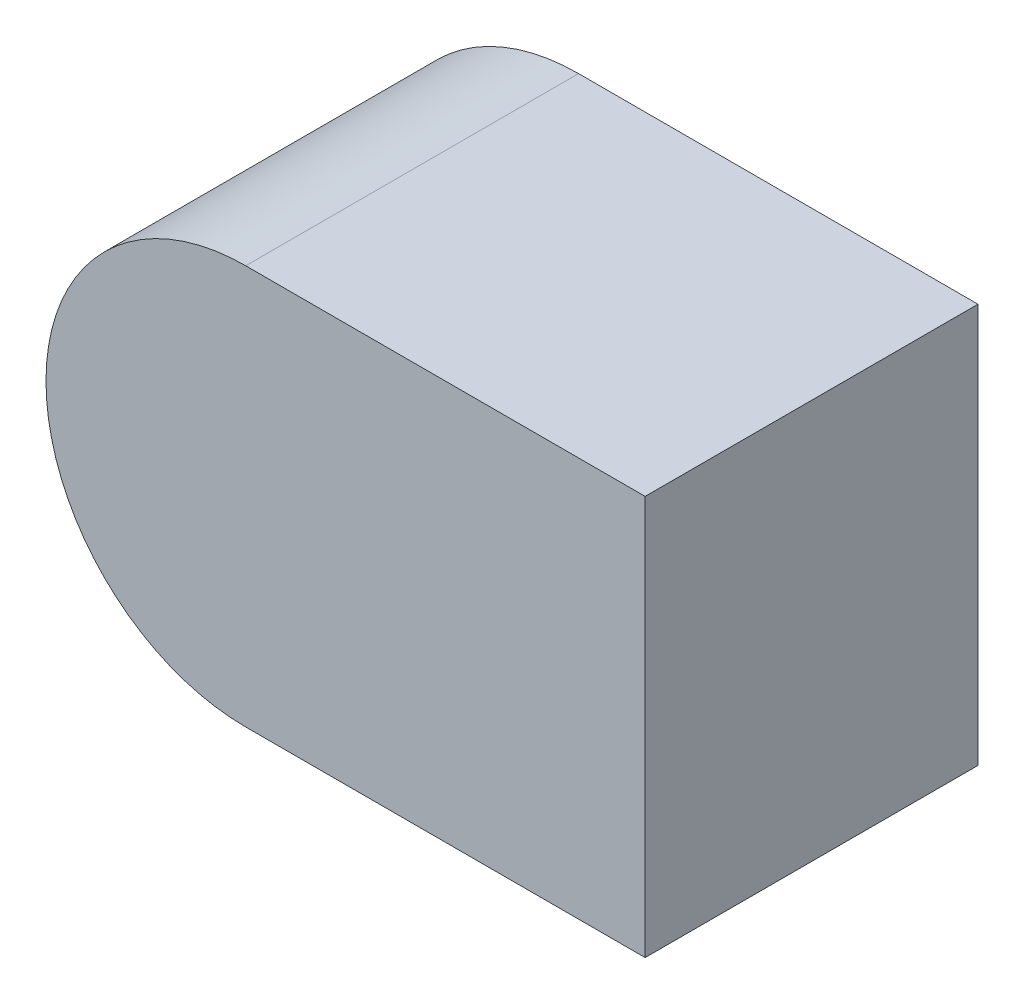
ISO-10303-21;
HEADER;
FILE_DESCRIPTION(('STEP AP214'),'2;1');
FILE_NAME('part.step','',(''),(''),'','','');
FILE_SCHEMA(('AUTOMOTIVE_DESIGN { 1 0 10303 214 1 1 1 1 }'));
ENDSEC;
DATA;
#1=APPLICATION_CONTEXT('core data for automotive mechanical design processes');
#2=APPLICATION_PROTOCOL_DEFINITION('international standard','automotive_design',2000,#1);
#3=PRODUCT_CONTEXT('',#1,'mechanical');
#4=PRODUCT('Part','Part','',(#3));
#5=PRODUCT_RELATED_PRODUCT_CATEGORY('part','',(#4));
#6=PRODUCT_DEFINITION_FORMATION('','',#4);
#7=PRODUCT_DEFINITION_CONTEXT('part definition',#1,'design');
#8=PRODUCT_DEFINITION('design','',#6,#7);
#9=PRODUCT_DEFINITION_SHAPE('','',#8);
#10=(LENGTH_UNIT() NAMED_UNIT(*) SI_UNIT(.MILLI.,.METRE.));
#11=(NAMED_UNIT(*) PLANE_ANGLE_UNIT() SI_UNIT($,.RADIAN.));
#12=(NAMED_UNIT(*) SI_UNIT($,.STERADIAN.) SOLID_ANGLE_UNIT());
#13=UNCERTAINTY_MEASURE_WITH_UNIT(LENGTH_MEASURE(1.E-05),#10,'distance_accuracy_value','');
#14=(GEOMETRIC_REPRESENTATION_CONTEXT(3) GLOBAL_UNCERTAINTY_ASSIGNED_CONTEXT((#13)) GLOBAL_UNIT_ASSIGNED_CONTEXT((#10,
#11,#12)) REPRESENTATION_CONTEXT('',''));
#15=CARTESIAN_POINT('',(0.,0.,0.));
#16=DIRECTION('',(0.,0.,1.));
#17=DIRECTION('',(1.,0.,0.));
#18=AXIS2_PLACEMENT_3D('',#15,#16,#17);
#19=CARTESIAN_POINT('',(-0.15,0.,0.));
#20=DIRECTION('',(0.,0.,1.));
#21=DIRECTION('',(-1.,0.,0.));
#22=AXIS2_PLACEMENT_3D('',#19,#20,#21);
#23=CYLINDRICAL_SURFACE('',#22,0.15);
#24=CARTESIAN_POINT('',(-0.15,0.,0.));
#25=DIRECTION('',(0.,0.,-1.));
#26=DIRECTION('',(1.,0.,0.));
#27=AXIS2_PLACEMENT_3D('',#24,#25,#26);
#28=CIRCLE('',#27,0.15);
#29=CARTESIAN_POINT('',(-0.15,-0.15,0.));
#30=VERTEX_POINT('',#29);
#31=CARTESIAN_POINT('',(-0.15,0.15,0.));
#32=VERTEX_POINT('',#31);
#33=EDGE_CURVE('E77',#30,#32,#28,.T.);
#34=ORIENTED_EDGE('',*,*,#33,.F.);
#35=DIRECTION('',(0.,0.,1.));
#36=VECTOR('',#35,1.);
#37=CARTESIAN_POINT('',(-0.15,-0.15,0.));
#38=LINE('',#37,#36);
#39=CARTESIAN_POINT('',(-0.15,-0.15,0.25));
#40=VERTEX_POINT('',#39);
#41=EDGE_CURVE('E11',#30,#40,#38,.T.);
#42=ORIENTED_EDGE('',*,*,#41,.T.);
#43=CARTESIAN_POINT('',(-0.15,0.,0.25));
#44=DIRECTION('',(0.,0.,1.));
#45=DIRECTION('',(1.,0.,0.));
#46=AXIS2_PLACEMENT_3D('',#43,#44,#45);
#47=CIRCLE('',#46,0.15);
#48=CARTESIAN_POINT('',(-0.15,0.15,0.25));
#49=VERTEX_POINT('',#48);
#50=EDGE_CURVE('E58',#49,#40,#47,.T.);
#51=ORIENTED_EDGE('',*,*,#50,.F.);
#52=DIRECTION('',(0.,0.,1.));
#53=VECTOR('',#52,1.);
#54=CARTESIAN_POINT('',(-0.15,0.15,0.));
#55=LINE('',#54,#53);
#56=EDGE_CURVE('E75',#32,#49,#55,.T.);
#57=ORIENTED_EDGE('',*,*,#56,.F.);
#58=EDGE_LOOP('',(#34,#42,#51,#57));
#59=FACE_BOUND('',#58,.T.);
#60=ADVANCED_FACE('F17',(#59),#23,.T.);
#61=CARTESIAN_POINT('',(-0.15,-0.15,0.25));
#62=DIRECTION('',(0.,1.,0.));
#63=DIRECTION('',(1.,0.,0.));
#64=AXIS2_PLACEMENT_3D('',#61,#62,#63);
#65=PLANE('',#64);
#66=DIRECTION('',(-1.,0.,0.));
#67=VECTOR('',#66,1.);
#68=CARTESIAN_POINT('',(0.15,-0.15,0.));
#69=LINE('',#68,#67);
#70=CARTESIAN_POINT('',(0.15,-0.15,0.));
#71=VERTEX_POINT('',#70);
#72=EDGE_CURVE('E90',#71,#30,#69,.T.);
#73=ORIENTED_EDGE('',*,*,#72,.F.);
#74=DIRECTION('',(0.,0.,1.));
#75=VECTOR('',#74,1.);
#76=CARTESIAN_POINT('',(0.15,-0.15,0.));
#77=LINE('',#76,#75);
#78=CARTESIAN_POINT('',(0.15,-0.15,0.25));
#79=VERTEX_POINT('',#78);
#80=EDGE_CURVE('E26',#71,#79,#77,.T.);
#81=ORIENTED_EDGE('',*,*,#80,.T.);
#82=DIRECTION('',(1.,0.,0.));
#83=VECTOR('',#82,1.);
#84=CARTESIAN_POINT('',(-0.15,-0.15,0.25));
#85=LINE('',#84,#83);
#86=EDGE_CURVE('E104',#40,#79,#85,.T.);
#87=ORIENTED_EDGE('',*,*,#86,.F.);
#88=ORIENTED_EDGE('',*,*,#41,.F.);
#89=EDGE_LOOP('',(#73,#81,#87,#88));
#90=FACE_BOUND('',#89,.T.);
#91=ADVANCED_FACE('F150',(#90),#65,.F.);
#92=CARTESIAN_POINT('',(0.15,-0.15,0.25));
#93=DIRECTION('',(-1.,0.,0.));
#94=DIRECTION('',(0.,1.,0.));
#95=AXIS2_PLACEMENT_3D('',#92,#93,#94);
#96=PLANE('',#95);
#97=DIRECTION('',(0.,-1.,0.));
#98=VECTOR('',#97,1.);
#99=CARTESIAN_POINT('',(0.15,0.15,0.));
#100=LINE('',#99,#98);
#101=CARTESIAN_POINT('',(0.15,0.15,0.));
#102=VERTEX_POINT('',#101);
#103=EDGE_CURVE('E97',#102,#71,#100,.T.);
#104=ORIENTED_EDGE('',*,*,#103,.F.);
#105=DIRECTION('',(0.,0.,1.));
#106=VECTOR('',#105,1.);
#107=CARTESIAN_POINT('',(0.15,0.15,0.));
#108=LINE('',#107,#106);
#109=CARTESIAN_POINT('',(0.15,0.15,0.25));
#110=VERTEX_POINT('',#109);
#111=EDGE_CURVE('E94',#102,#110,#108,.T.);
#112=ORIENTED_EDGE('',*,*,#111,.T.);
#113=DIRECTION('',(0.,1.,0.));
#114=VECTOR('',#113,1.);
#115=CARTESIAN_POINT('',(0.15,-0.15,0.25));
#116=LINE('',#115,#114);
#117=EDGE_CURVE('E49',#79,#110,#116,.T.);
#118=ORIENTED_EDGE('',*,*,#117,.F.);
#119=ORIENTED_EDGE('',*,*,#80,.F.);
#120=EDGE_LOOP('',(#104,#112,#118,#119));
#121=FACE_BOUND('',#120,.T.);
#122=ADVANCED_FACE('F127',(#121),#96,.F.);
#123=CARTESIAN_POINT('',(-0.04553418012615,0.,0.25));
#124=DIRECTION('',(0.,0.,1.));
#125=DIRECTION('',(0.,-1.,0.));
#126=AXIS2_PLACEMENT_3D('',#123,#124,#125);
#127=PLANE('',#126);
#128=ORIENTED_EDGE('',*,*,#86,.T.);
#129=ORIENTED_EDGE('',*,*,#117,.T.);
#130=DIRECTION('',(-1.,0.,0.));
#131=VECTOR('',#130,1.);
#132=CARTESIAN_POINT('',(0.15,0.15,0.25));
#133=LINE('',#132,#131);
#134=EDGE_CURVE('E83',#110,#49,#133,.T.);
#135=ORIENTED_EDGE('',*,*,#134,.T.);
#136=ORIENTED_EDGE('',*,*,#50,.T.);
#137=EDGE_LOOP('',(#128,#129,#135,#136));
#138=FACE_BOUND('',#137,.T.);
#139=ADVANCED_FACE('F122',(#138),#127,.T.);
#140=CARTESIAN_POINT('',(0.15,0.15,0.25));
#141=DIRECTION('',(0.,-1.,0.));
#142=DIRECTION('',(0.,0.,-1.));
#143=AXIS2_PLACEMENT_3D('',#140,#141,#142);
#144=PLANE('',#143);
#145=DIRECTION('',(1.,0.,0.));
#146=VECTOR('',#145,1.);
#147=CARTESIAN_POINT('',(-0.15,0.15,0.));
#148=LINE('',#147,#146);
#149=EDGE_CURVE('E89',#32,#102,#148,.T.);
#150=ORIENTED_EDGE('',*,*,#149,.F.);
#151=ORIENTED_EDGE('',*,*,#56,.T.);
#152=ORIENTED_EDGE('',*,*,#134,.F.);
#153=ORIENTED_EDGE('',*,*,#111,.F.);
#154=EDGE_LOOP('',(#150,#151,#152,#153));
#155=FACE_BOUND('',#154,.T.);
#156=ADVANCED_FACE('F93',(#155),#144,.F.);
#157=CARTESIAN_POINT('',(-0.04553418012615,0.,0.));
#158=DIRECTION('',(0.,0.,1.));
#159=DIRECTION('',(1.,0.,0.));
#160=AXIS2_PLACEMENT_3D('',#157,#158,#159);
#161=PLANE('',#160);
#162=ORIENTED_EDGE('',*,*,#149,.T.);
#163=ORIENTED_EDGE('',*,*,#103,.T.);
#164=ORIENTED_EDGE('',*,*,#72,.T.);
#165=ORIENTED_EDGE('',*,*,#33,.T.);
#166=EDGE_LOOP('',(#162,#163,#164,#165));
#167=FACE_BOUND('',#166,.T.);
#168=ADVANCED_FACE('F87',(#167),#161,.F.);
#169=CLOSED_SHELL('',(#60,#91,#122,#139,#156,#168));
#170=MANIFOLD_SOLID_BREP('B1',#169);
#171=ADVANCED_BREP_SHAPE_REPRESENTATION('',(#18,#170),#14);
#172=SHAPE_DEFINITION_REPRESENTATION(#9,#171);
ENDSEC;
END-ISO-10303-21;
